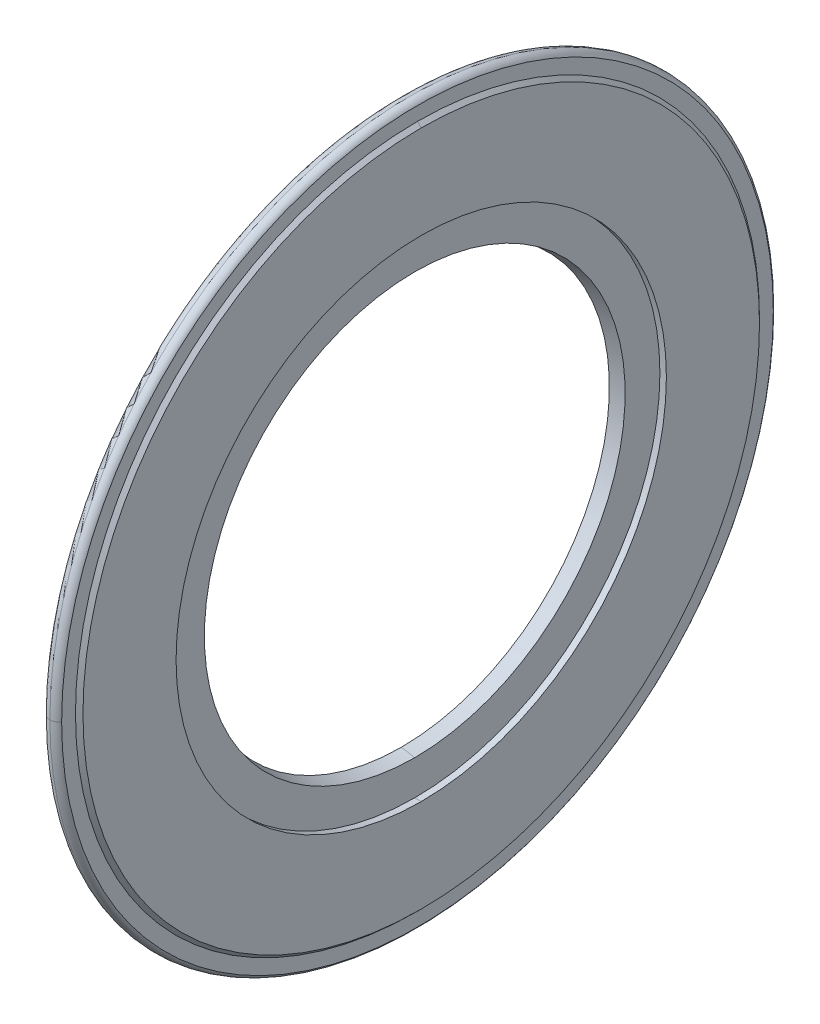
ISO-10303-21;
HEADER;
FILE_DESCRIPTION(('STEP AP214'),'2;1');
FILE_NAME('part.step','',(''),(''),'','','');
FILE_SCHEMA(('AUTOMOTIVE_DESIGN { 1 0 10303 214 1 1 1 1 }'));
ENDSEC;
DATA;
#1=APPLICATION_CONTEXT('core data for automotive mechanical design processes');
#2=APPLICATION_PROTOCOL_DEFINITION('international standard','automotive_design',2000,#1);
#3=PRODUCT_CONTEXT('',#1,'mechanical');
#4=PRODUCT('Part','Part','',(#3));
#5=PRODUCT_RELATED_PRODUCT_CATEGORY('part','',(#4));
#6=PRODUCT_DEFINITION_FORMATION('','',#4);
#7=PRODUCT_DEFINITION_CONTEXT('part definition',#1,'design');
#8=PRODUCT_DEFINITION('design','',#6,#7);
#9=PRODUCT_DEFINITION_SHAPE('','',#8);
#10=(LENGTH_UNIT() NAMED_UNIT(*) SI_UNIT(.MILLI.,.METRE.));
#11=(NAMED_UNIT(*) PLANE_ANGLE_UNIT() SI_UNIT($,.RADIAN.));
#12=(NAMED_UNIT(*) SI_UNIT($,.STERADIAN.) SOLID_ANGLE_UNIT());
#13=UNCERTAINTY_MEASURE_WITH_UNIT(LENGTH_MEASURE(1.E-05),#10,'distance_accuracy_value','');
#14=(GEOMETRIC_REPRESENTATION_CONTEXT(3) GLOBAL_UNCERTAINTY_ASSIGNED_CONTEXT((#13)) GLOBAL_UNIT_ASSIGNED_CONTEXT((#10,
#11,#12)) REPRESENTATION_CONTEXT('',''));
#15=CARTESIAN_POINT('',(0.,0.,0.));
#16=DIRECTION('',(0.,0.,1.));
#17=DIRECTION('',(1.,0.,0.));
#18=AXIS2_PLACEMENT_3D('',#15,#16,#17);
#19=CARTESIAN_POINT('',(7.4756,0.,0.));
#20=DIRECTION('',(1.,0.,0.));
#21=DIRECTION('',(0.,1.,0.));
#22=AXIS2_PLACEMENT_3D('',#19,#20,#21);
#23=CONICAL_SURFACE('',#22,7.36375359064417,0.174532925199433);
#24=DIRECTION('',(-0.984807753012208,-0.17364817766693,0.));
#25=VECTOR('',#24,1.);
#26=CARTESIAN_POINT('',(7.4756,7.36375359064417,0.));
#27=LINE('',#26,#25);
#28=CARTESIAN_POINT('',(7.7112,7.40529622729908,0.));
#29=VERTEX_POINT('',#28);
#30=CARTESIAN_POINT('',(7.24,7.32221095398925,0.));
#31=VERTEX_POINT('',#30);
#32=EDGE_CURVE('E138',#29,#31,#27,.T.);
#33=ORIENTED_EDGE('',*,*,#32,.T.);
#34=CARTESIAN_POINT('',(7.24,0.,0.));
#35=DIRECTION('',(-1.,0.,0.));
#36=DIRECTION('',(0.,1.,0.));
#37=AXIS2_PLACEMENT_3D('',#34,#35,#36);
#38=CIRCLE('',#37,7.32221095398925);
#39=CARTESIAN_POINT('',(7.24,-7.32221095398925,0.));
#40=VERTEX_POINT('',#39);
#41=EDGE_CURVE('E11',#31,#40,#38,.T.);
#42=ORIENTED_EDGE('',*,*,#41,.T.);
#43=DIRECTION('',(0.984807753012208,-0.17364817766693,0.));
#44=VECTOR('',#43,1.);
#45=CARTESIAN_POINT('',(7.4756,-7.36375359064417,0.));
#46=LINE('',#45,#44);
#47=CARTESIAN_POINT('',(7.7112,-7.40529622729908,0.));
#48=VERTEX_POINT('',#47);
#49=EDGE_CURVE('E132',#40,#48,#46,.T.);
#50=ORIENTED_EDGE('',*,*,#49,.T.);
#51=CARTESIAN_POINT('',(7.7112,0.,0.));
#52=DIRECTION('',(-1.,0.,0.));
#53=DIRECTION('',(0.,1.,0.));
#54=AXIS2_PLACEMENT_3D('',#51,#52,#53);
#55=CIRCLE('',#54,7.40529622729908);
#56=EDGE_CURVE('E120',#29,#48,#55,.T.);
#57=ORIENTED_EDGE('',*,*,#56,.F.);
#58=EDGE_LOOP('',(#33,#42,#50,#57));
#59=FACE_BOUND('',#58,.T.);
#60=ADVANCED_FACE('F17',(#59),#23,.F.);
#61=CARTESIAN_POINT('',(7.1248109574196,0.,0.));
#62=DIRECTION('',(-1.,0.,0.));
#63=DIRECTION('',(0.,1.,0.));
#64=AXIS2_PLACEMENT_3D('',#61,#62,#63);
#65=CONICAL_SURFACE('',#64,7.97548047699463,1.39626340159546);
#66=DIRECTION('',(-0.17364817766693,0.984807753012208,0.));
#67=VECTOR('',#66,1.);
#68=CARTESIAN_POINT('',(7.1248109574196,7.97548047699463,0.));
#69=LINE('',#68,#67);
#70=CARTESIAN_POINT('',(7.00962191483921,8.62875,0.));
#71=VERTEX_POINT('',#70);
#72=EDGE_CURVE('E151',#31,#71,#69,.T.);
#73=ORIENTED_EDGE('',*,*,#72,.T.);
#74=CARTESIAN_POINT('',(7.00962191483921,0.,0.));
#75=DIRECTION('',(-1.,0.,0.));
#76=DIRECTION('',(0.,1.,0.));
#77=AXIS2_PLACEMENT_3D('',#74,#75,#76);
#78=CIRCLE('',#77,8.62875);
#79=CARTESIAN_POINT('',(7.00962191483921,-8.62875,0.));
#80=VERTEX_POINT('',#79);
#81=EDGE_CURVE('E25',#71,#80,#78,.T.);
#82=ORIENTED_EDGE('',*,*,#81,.T.);
#83=DIRECTION('',(0.17364817766693,0.984807753012208,0.));
#84=VECTOR('',#83,1.);
#85=CARTESIAN_POINT('',(7.1248109574196,-7.97548047699463,0.));
#86=LINE('',#85,#84);
#87=EDGE_CURVE('E154',#80,#40,#86,.T.);
#88=ORIENTED_EDGE('',*,*,#87,.T.);
#89=ORIENTED_EDGE('',*,*,#41,.F.);
#90=EDGE_LOOP('',(#73,#82,#88,#89));
#91=FACE_BOUND('',#90,.T.);
#92=ADVANCED_FACE('F225',(#91),#65,.F.);
#93=CARTESIAN_POINT('',(6.8968109574196,0.,0.));
#94=DIRECTION('',(-1.,0.,0.));
#95=DIRECTION('',(0.,1.,0.));
#96=AXIS2_PLACEMENT_3D('',#93,#94,#95);
#97=CYLINDRICAL_SURFACE('',#96,8.62875);
#98=DIRECTION('',(-1.,0.,0.));
#99=VECTOR('',#98,1.);
#100=CARTESIAN_POINT('',(6.8968109574196,8.62875,0.));
#101=LINE('',#100,#99);
#102=CARTESIAN_POINT('',(6.784,8.62875,0.));
#103=VERTEX_POINT('',#102);
#104=EDGE_CURVE('E158',#71,#103,#101,.T.);
#105=ORIENTED_EDGE('',*,*,#104,.T.);
#106=CARTESIAN_POINT('',(6.784,0.,0.));
#107=DIRECTION('',(-1.,0.,0.));
#108=DIRECTION('',(0.,1.,0.));
#109=AXIS2_PLACEMENT_3D('',#106,#107,#108);
#110=CIRCLE('',#109,8.62875);
#111=CARTESIAN_POINT('',(6.784,-8.62875,0.));
#112=VERTEX_POINT('',#111);
#113=EDGE_CURVE('E172',#103,#112,#110,.T.);
#114=ORIENTED_EDGE('',*,*,#113,.T.);
#115=DIRECTION('',(1.,0.,0.));
#116=VECTOR('',#115,1.);
#117=CARTESIAN_POINT('',(6.8968109574196,-8.62875,0.));
#118=LINE('',#117,#116);
#119=EDGE_CURVE('E163',#112,#80,#118,.T.);
#120=ORIENTED_EDGE('',*,*,#119,.T.);
#121=ORIENTED_EDGE('',*,*,#81,.F.);
#122=EDGE_LOOP('',(#105,#114,#120,#121));
#123=FACE_BOUND('',#122,.T.);
#124=ADVANCED_FACE('F234',(#123),#97,.F.);
#125=CARTESIAN_POINT('',(7.1336,0.,0.));
#126=DIRECTION('',(1.,0.,0.));
#127=DIRECTION('',(0.,1.,0.));
#128=AXIS2_PLACEMENT_3D('',#125,#126,#127);
#129=CONICAL_SURFACE('',#128,8.97835,0.785398163397447);
#130=DIRECTION('',(-0.707106781186548,-0.707106781186547,0.));
#131=VECTOR('',#130,1.);
#132=CARTESIAN_POINT('',(7.1336,8.97835,0.));
#133=LINE('',#132,#131);
#134=CARTESIAN_POINT('',(7.4832,9.32795,0.));
#135=VERTEX_POINT('',#134);
#136=EDGE_CURVE('E162',#135,#103,#133,.T.);
#137=ORIENTED_EDGE('',*,*,#136,.T.);
#138=CARTESIAN_POINT('',(6.784,0.,0.));
#139=DIRECTION('',(-1.,0.,0.));
#140=DIRECTION('',(0.,1.,0.));
#141=AXIS2_PLACEMENT_3D('',#138,#139,#140);
#142=CIRCLE('',#141,8.62875);
#143=EDGE_CURVE('E159',#112,#103,#142,.T.);
#144=ORIENTED_EDGE('',*,*,#143,.F.);
#145=DIRECTION('',(0.707106781186548,-0.707106781186547,0.));
#146=VECTOR('',#145,1.);
#147=CARTESIAN_POINT('',(7.1336,-8.97835,0.));
#148=LINE('',#147,#146);
#149=CARTESIAN_POINT('',(7.4832,-9.32795,0.));
#150=VERTEX_POINT('',#149);
#151=EDGE_CURVE('E169',#112,#150,#148,.T.);
#152=ORIENTED_EDGE('',*,*,#151,.T.);
#153=CARTESIAN_POINT('',(7.4832,0.,0.));
#154=DIRECTION('',(-1.,0.,0.));
#155=DIRECTION('',(0.,1.,0.));
#156=AXIS2_PLACEMENT_3D('',#153,#154,#155);
#157=CIRCLE('',#156,9.32795);
#158=EDGE_CURVE('E222',#150,#135,#157,.T.);
#159=ORIENTED_EDGE('',*,*,#158,.T.);
#160=EDGE_LOOP('',(#137,#144,#152,#159));
#161=FACE_BOUND('',#160,.T.);
#162=ADVANCED_FACE('F294',(#161),#129,.T.);
#163=CARTESIAN_POINT('',(7.4832,10.4936875,0.));
#164=DIRECTION('',(-1.,0.,0.));
#165=DIRECTION('',(0.,0.,1.));
#166=AXIS2_PLACEMENT_3D('',#163,#164,#165);
#167=PLANE('',#166);
#168=CARTESIAN_POINT('',(7.4832,0.,0.));
#169=DIRECTION('',(-1.,0.,0.));
#170=DIRECTION('',(0.,1.,0.));
#171=AXIS2_PLACEMENT_3D('',#168,#169,#170);
#172=CIRCLE('',#171,9.32795);
#173=EDGE_CURVE('E166',#135,#150,#172,.T.);
#174=ORIENTED_EDGE('',*,*,#173,.F.);
#175=ORIENTED_EDGE('',*,*,#158,.F.);
#176=EDGE_LOOP('',(#174,#175));
#177=FACE_BOUND('',#176,.T.);
#178=CARTESIAN_POINT('',(7.4832,0.,0.));
#179=DIRECTION('',(-1.,0.,0.));
#180=DIRECTION('',(0.,1.,0.));
#181=AXIS2_PLACEMENT_3D('',#178,#179,#180);
#182=CIRCLE('',#181,11.659425);
#183=CARTESIAN_POINT('',(7.4832,11.659425,0.));
#184=VERTEX_POINT('',#183);
#185=CARTESIAN_POINT('',(7.4832,-11.659425,0.));
#186=VERTEX_POINT('',#185);
#187=EDGE_CURVE('E220',#184,#186,#182,.T.);
#188=ORIENTED_EDGE('',*,*,#187,.T.);
#189=CARTESIAN_POINT('',(7.4832,0.,0.));
#190=DIRECTION('',(-1.,0.,0.));
#191=DIRECTION('',(0.,1.,0.));
#192=AXIS2_PLACEMENT_3D('',#189,#190,#191);
#193=CIRCLE('',#192,11.659425);
#194=EDGE_CURVE('E177',#186,#184,#193,.T.);
#195=ORIENTED_EDGE('',*,*,#194,.T.);
#196=EDGE_LOOP('',(#188,#195));
#197=FACE_BOUND('',#196,.T.);
#198=ADVANCED_FACE('F299',(#177,#197),#167,.T.);
#199=CARTESIAN_POINT('',(7.29640031699767,0.,0.));
#200=DIRECTION('',(-1.,0.,0.));
#201=DIRECTION('',(0.,1.,0.));
#202=AXIS2_PLACEMENT_3D('',#199,#200,#201);
#203=CYLINDRICAL_SURFACE('',#202,11.659425);
#204=DIRECTION('',(-1.,0.,0.));
#205=VECTOR('',#204,1.);
#206=CARTESIAN_POINT('',(7.29640031699767,11.659425,0.));
#207=LINE('',#206,#205);
#208=CARTESIAN_POINT('',(7.10960063399534,11.659425,0.));
#209=VERTEX_POINT('',#208);
#210=EDGE_CURVE('E174',#184,#209,#207,.T.);
#211=ORIENTED_EDGE('',*,*,#210,.T.);
#212=CARTESIAN_POINT('',(7.10960063399534,0.,0.));
#213=DIRECTION('',(-1.,0.,0.));
#214=DIRECTION('',(0.,1.,0.));
#215=AXIS2_PLACEMENT_3D('',#212,#213,#214);
#216=CIRCLE('',#215,11.659425);
#217=CARTESIAN_POINT('',(7.10960063399534,-11.659425,0.));
#218=VERTEX_POINT('',#217);
#219=EDGE_CURVE('E198',#209,#218,#216,.T.);
#220=ORIENTED_EDGE('',*,*,#219,.T.);
#221=DIRECTION('',(1.,0.,0.));
#222=VECTOR('',#221,1.);
#223=CARTESIAN_POINT('',(7.29640031699767,-11.659425,0.));
#224=LINE('',#223,#222);
#225=EDGE_CURVE('E180',#218,#186,#224,.T.);
#226=ORIENTED_EDGE('',*,*,#225,.T.);
#227=ORIENTED_EDGE('',*,*,#187,.F.);
#228=EDGE_LOOP('',(#211,#220,#226,#227));
#229=FACE_BOUND('',#228,.T.);
#230=ADVANCED_FACE('F303',(#229),#203,.F.);
#231=CARTESIAN_POINT('',(7.17710953853982,0.,0.));
#232=DIRECTION('',(1.,0.,0.));
#233=DIRECTION('',(0.,1.,0.));
#234=AXIS2_PLACEMENT_3D('',#231,#232,#233);
#235=CONICAL_SURFACE('',#234,12.0422870230054,1.39626340159546);
#236=DIRECTION('',(-0.173648177666931,-0.984807753012208,0.));
#237=VECTOR('',#236,1.);
#238=CARTESIAN_POINT('',(7.17710953853982,12.0422870230054,0.));
#239=LINE('',#238,#237);
#240=CARTESIAN_POINT('',(7.24461844308429,12.4251490460107,0.));
#241=VERTEX_POINT('',#240);
#242=EDGE_CURVE('E186',#241,#209,#239,.T.);
#243=ORIENTED_EDGE('',*,*,#242,.T.);
#244=CARTESIAN_POINT('',(7.10960063399534,0.,0.));
#245=DIRECTION('',(-1.,0.,0.));
#246=DIRECTION('',(0.,1.,0.));
#247=AXIS2_PLACEMENT_3D('',#244,#245,#246);
#248=CIRCLE('',#247,11.659425);
#249=EDGE_CURVE('E183',#218,#209,#248,.T.);
#250=ORIENTED_EDGE('',*,*,#249,.F.);
#251=DIRECTION('',(0.173648177666931,-0.984807753012208,0.));
#252=VECTOR('',#251,1.);
#253=CARTESIAN_POINT('',(7.17710953853982,-12.0422870230054,0.));
#254=LINE('',#253,#252);
#255=CARTESIAN_POINT('',(7.24461844308429,-12.4251490460107,0.));
#256=VERTEX_POINT('',#255);
#257=EDGE_CURVE('E195',#218,#256,#254,.T.);
#258=ORIENTED_EDGE('',*,*,#257,.T.);
#259=CARTESIAN_POINT('',(7.24461844308429,0.,0.));
#260=DIRECTION('',(-1.,0.,0.));
#261=DIRECTION('',(0.,1.,0.));
#262=AXIS2_PLACEMENT_3D('',#259,#260,#261);
#263=CIRCLE('',#262,12.4251490460107);
#264=CARTESIAN_POINT('',(7.24461844308429,0.,12.4251490460107));
#265=VERTEX_POINT('',#264);
#266=EDGE_CURVE('E218',#256,#265,#263,.T.);
#267=ORIENTED_EDGE('',*,*,#266,.T.);
#268=CARTESIAN_POINT('',(7.24461844308429,0.,0.));
#269=DIRECTION('',(-1.,0.,0.));
#270=DIRECTION('',(0.,1.,0.));
#271=AXIS2_PLACEMENT_3D('',#268,#269,#270);
#272=CIRCLE('',#271,12.4251490460107);
#273=EDGE_CURVE('E203',#265,#241,#272,.T.);
#274=ORIENTED_EDGE('',*,*,#273,.T.);
#275=EDGE_LOOP('',(#243,#250,#258,#267,#274));
#276=FACE_BOUND('',#275,.T.);
#277=ADVANCED_FACE('F307',(#276),#235,.T.);
#278=CARTESIAN_POINT('',(7.544,0.,0.));
#279=DIRECTION('',(-1.,0.,0.));
#280=DIRECTION('',(0.,0.,1.));
#281=AXIS2_PLACEMENT_3D('',#278,#279,#280);
#282=TOROIDAL_SURFACE('',#281,12.37236,0.304);
#283=CARTESIAN_POINT('',(7.544,0.,0.));
#284=DIRECTION('',(-1.,0.,0.));
#285=DIRECTION('',(0.,0.,1.));
#286=AXIS2_PLACEMENT_3D('',#283,#284,#285);
#287=CIRCLE('',#286,12.67636);
#288=CARTESIAN_POINT('',(7.544,0.,-12.67636));
#289=VERTEX_POINT('',#288);
#290=CARTESIAN_POINT('',(7.544,0.,12.67636));
#291=VERTEX_POINT('',#290);
#292=EDGE_CURVE('E244',#289,#291,#287,.T.);
#293=ORIENTED_EDGE('',*,*,#292,.T.);
#294=CARTESIAN_POINT('',(7.544,0.,12.37236));
#295=DIRECTION('',(0.,-1.,0.));
#296=DIRECTION('',(0.,0.,1.));
#297=AXIS2_PLACEMENT_3D('',#294,#295,#296);
#298=CIRCLE('',#297,0.304);
#299=EDGE_CURVE('E205',#291,#265,#298,.T.);
#300=ORIENTED_EDGE('',*,*,#299,.T.);
#301=ORIENTED_EDGE('',*,*,#266,.F.);
#302=CARTESIAN_POINT('',(7.24461844308429,0.,0.));
#303=DIRECTION('',(-1.,0.,0.));
#304=DIRECTION('',(0.,1.,0.));
#305=AXIS2_PLACEMENT_3D('',#302,#303,#304);
#306=CIRCLE('',#305,12.4251490460107);
#307=CARTESIAN_POINT('',(7.24461844308429,0.,-12.4251490460107));
#308=VERTEX_POINT('',#307);
#309=EDGE_CURVE('E192',#308,#256,#306,.T.);
#310=ORIENTED_EDGE('',*,*,#309,.F.);
#311=CARTESIAN_POINT('',(7.544,0.,-12.37236));
#312=DIRECTION('',(0.,-1.,0.));
#313=DIRECTION('',(0.,0.,-1.));
#314=AXIS2_PLACEMENT_3D('',#311,#312,#313);
#315=CIRCLE('',#314,0.304);
#316=EDGE_CURVE('E200',#308,#289,#315,.T.);
#317=ORIENTED_EDGE('',*,*,#316,.T.);
#318=EDGE_LOOP('',(#293,#300,#301,#310,#317));
#319=FACE_BOUND('',#318,.T.);
#320=ADVANCED_FACE('F311',(#319),#282,.T.);
#321=CARTESIAN_POINT('',(7.80727172275047,12.28116,0.));
#322=DIRECTION('',(1.,0.,0.));
#323=DIRECTION('',(0.,0.,1.));
#324=AXIS2_PLACEMENT_3D('',#321,#322,#323);
#325=PLANE('',#324);
#326=CARTESIAN_POINT('',(7.80727172275047,0.,0.));
#327=DIRECTION('',(-1.,0.,0.));
#328=DIRECTION('',(0.,1.,0.));
#329=AXIS2_PLACEMENT_3D('',#326,#327,#328);
#330=CIRCLE('',#329,12.03796);
#331=CARTESIAN_POINT('',(7.80727172275047,12.03796,0.));
#332=VERTEX_POINT('',#331);
#333=CARTESIAN_POINT('',(7.80727172275047,-12.03796,0.));
#334=VERTEX_POINT('',#333);
#335=EDGE_CURVE('E214',#332,#334,#330,.T.);
#336=ORIENTED_EDGE('',*,*,#335,.T.);
#337=CARTESIAN_POINT('',(7.80727172275047,0.,0.));
#338=DIRECTION('',(-1.,0.,0.));
#339=DIRECTION('',(0.,1.,0.));
#340=AXIS2_PLACEMENT_3D('',#337,#338,#339);
#341=CIRCLE('',#340,12.03796);
#342=EDGE_CURVE('E94',#334,#332,#341,.T.);
#343=ORIENTED_EDGE('',*,*,#342,.T.);
#344=EDGE_LOOP('',(#336,#343));
#345=FACE_BOUND('',#344,.T.);
#346=CARTESIAN_POINT('',(7.80727172275047,0.,0.));
#347=DIRECTION('',(-1.,0.,0.));
#348=DIRECTION('',(0.,1.,0.));
#349=AXIS2_PLACEMENT_3D('',#346,#347,#348);
#350=CIRCLE('',#349,12.52436);
#351=CARTESIAN_POINT('',(7.80727172275047,0.,12.52436));
#352=VERTEX_POINT('',#351);
#353=CARTESIAN_POINT('',(7.80727172275047,0.,-12.52436));
#354=VERTEX_POINT('',#353);
#355=EDGE_CURVE('E140',#352,#354,#350,.T.);
#356=ORIENTED_EDGE('',*,*,#355,.F.);
#357=CARTESIAN_POINT('',(7.80727172275047,0.,0.));
#358=DIRECTION('',(-1.,0.,0.));
#359=DIRECTION('',(0.,1.,0.));
#360=AXIS2_PLACEMENT_3D('',#357,#358,#359);
#361=CIRCLE('',#360,12.52436);
#362=EDGE_CURVE('E255',#354,#352,#361,.T.);
#363=ORIENTED_EDGE('',*,*,#362,.F.);
#364=EDGE_LOOP('',(#356,#363));
#365=FACE_BOUND('',#364,.T.);
#366=ADVANCED_FACE('F314',(#345,#365),#325,.T.);
#367=CARTESIAN_POINT('',(7.87323586137523,0.,0.));
#368=DIRECTION('',(-1.,0.,0.));
#369=DIRECTION('',(0.,1.,0.));
#370=AXIS2_PLACEMENT_3D('',#367,#368,#369);
#371=CONICAL_SURFACE('',#370,11.9719958613752,0.785398163397442);
#372=DIRECTION('',(-0.707106781186552,0.707106781186543,0.));
#373=VECTOR('',#372,1.);
#374=CARTESIAN_POINT('',(7.87323586137523,11.9719958613752,0.));
#375=LINE('',#374,#373);
#376=CARTESIAN_POINT('',(7.9392,11.9060317227505,0.));
#377=VERTEX_POINT('',#376);
#378=EDGE_CURVE('E208',#377,#332,#375,.T.);
#379=ORIENTED_EDGE('',*,*,#378,.T.);
#380=ORIENTED_EDGE('',*,*,#342,.F.);
#381=DIRECTION('',(0.707106781186552,0.707106781186543,0.));
#382=VECTOR('',#381,1.);
#383=CARTESIAN_POINT('',(7.87323586137523,-11.9719958613752,0.));
#384=LINE('',#383,#382);
#385=CARTESIAN_POINT('',(7.9392,-11.9060317227505,0.));
#386=VERTEX_POINT('',#385);
#387=EDGE_CURVE('E212',#334,#386,#384,.T.);
#388=ORIENTED_EDGE('',*,*,#387,.T.);
#389=CARTESIAN_POINT('',(7.9392,0.,0.));
#390=DIRECTION('',(-1.,0.,0.));
#391=DIRECTION('',(0.,1.,0.));
#392=AXIS2_PLACEMENT_3D('',#389,#390,#391);
#393=CIRCLE('',#392,11.9060317227505);
#394=EDGE_CURVE('E86',#386,#377,#393,.T.);
#395=ORIENTED_EDGE('',*,*,#394,.T.);
#396=EDGE_LOOP('',(#379,#380,#388,#395));
#397=FACE_BOUND('',#396,.T.);
#398=ADVANCED_FACE('F319',(#397),#371,.T.);
#399=CARTESIAN_POINT('',(7.9392,10.2673908613752,0.));
#400=DIRECTION('',(1.,0.,0.));
#401=DIRECTION('',(0.,1.,0.));
#402=AXIS2_PLACEMENT_3D('',#399,#400,#401);
#403=PLANE('',#402);
#404=CARTESIAN_POINT('',(7.9392,0.,0.));
#405=DIRECTION('',(-1.,0.,0.));
#406=DIRECTION('',(0.,1.,0.));
#407=AXIS2_PLACEMENT_3D('',#404,#405,#406);
#408=CIRCLE('',#407,8.62875);
#409=CARTESIAN_POINT('',(7.9392,8.62875,0.));
#410=VERTEX_POINT('',#409);
#411=CARTESIAN_POINT('',(7.9392,-8.62875,0.));
#412=VERTEX_POINT('',#411);
#413=EDGE_CURVE('E129',#410,#412,#408,.T.);
#414=ORIENTED_EDGE('',*,*,#413,.T.);
#415=CARTESIAN_POINT('',(7.9392,0.,0.));
#416=DIRECTION('',(-1.,0.,0.));
#417=DIRECTION('',(0.,1.,0.));
#418=AXIS2_PLACEMENT_3D('',#415,#416,#417);
#419=CIRCLE('',#418,8.62875);
#420=EDGE_CURVE('E144',#412,#410,#419,.T.);
#421=ORIENTED_EDGE('',*,*,#420,.T.);
#422=EDGE_LOOP('',(#414,#421));
#423=FACE_BOUND('',#422,.T.);
#424=CARTESIAN_POINT('',(7.9392,0.,0.));
#425=DIRECTION('',(-1.,0.,0.));
#426=DIRECTION('',(0.,1.,0.));
#427=AXIS2_PLACEMENT_3D('',#424,#425,#426);
#428=CIRCLE('',#427,11.9060317227505);
#429=EDGE_CURVE('E211',#377,#386,#428,.T.);
#430=ORIENTED_EDGE('',*,*,#429,.F.);
#431=ORIENTED_EDGE('',*,*,#394,.F.);
#432=EDGE_LOOP('',(#430,#431));
#433=FACE_BOUND('',#432,.T.);
#434=ADVANCED_FACE('F270',(#423,#433),#403,.T.);
#435=CARTESIAN_POINT('',(7.8252,0.,0.));
#436=DIRECTION('',(-1.,0.,0.));
#437=DIRECTION('',(0.,1.,0.));
#438=AXIS2_PLACEMENT_3D('',#435,#436,#437);
#439=CYLINDRICAL_SURFACE('',#438,8.62875);
#440=DIRECTION('',(-1.,0.,0.));
#441=VECTOR('',#440,1.);
#442=CARTESIAN_POINT('',(7.8252,8.62875,0.));
#443=LINE('',#442,#441);
#444=CARTESIAN_POINT('',(7.7112,8.62875,0.));
#445=VERTEX_POINT('',#444);
#446=EDGE_CURVE('E249',#410,#445,#443,.T.);
#447=ORIENTED_EDGE('',*,*,#446,.T.);
#448=CARTESIAN_POINT('',(7.7112,0.,0.));
#449=DIRECTION('',(-1.,0.,0.));
#450=DIRECTION('',(0.,1.,0.));
#451=AXIS2_PLACEMENT_3D('',#448,#449,#450);
#452=CIRCLE('',#451,8.62875);
#453=CARTESIAN_POINT('',(7.7112,-8.62875,0.));
#454=VERTEX_POINT('',#453);
#455=EDGE_CURVE('E33',#445,#454,#452,.T.);
#456=ORIENTED_EDGE('',*,*,#455,.T.);
#457=DIRECTION('',(1.,0.,0.));
#458=VECTOR('',#457,1.);
#459=CARTESIAN_POINT('',(7.8252,-8.62875,0.));
#460=LINE('',#459,#458);
#461=EDGE_CURVE('E145',#454,#412,#460,.T.);
#462=ORIENTED_EDGE('',*,*,#461,.T.);
#463=ORIENTED_EDGE('',*,*,#413,.F.);
#464=EDGE_LOOP('',(#447,#456,#462,#463));
#465=FACE_BOUND('',#464,.T.);
#466=ADVANCED_FACE('F275',(#465),#439,.F.);
#467=CARTESIAN_POINT('',(7.7112,8.01702311364954,0.));
#468=DIRECTION('',(1.,0.,0.));
#469=DIRECTION('',(0.,-1.,0.));
#470=AXIS2_PLACEMENT_3D('',#467,#468,#469);
#471=PLANE('',#470);
#472=ORIENTED_EDGE('',*,*,#56,.T.);
#473=CARTESIAN_POINT('',(7.7112,0.,0.));
#474=DIRECTION('',(-1.,0.,0.));
#475=DIRECTION('',(0.,1.,0.));
#476=AXIS2_PLACEMENT_3D('',#473,#474,#475);
#477=CIRCLE('',#476,7.40529622729908);
#478=EDGE_CURVE('E125',#48,#29,#477,.T.);
#479=ORIENTED_EDGE('',*,*,#478,.T.);
#480=EDGE_LOOP('',(#472,#479));
#481=FACE_BOUND('',#480,.T.);
#482=ORIENTED_EDGE('',*,*,#455,.F.);
#483=CARTESIAN_POINT('',(7.7112,0.,0.));
#484=DIRECTION('',(-1.,0.,0.));
#485=DIRECTION('',(0.,1.,0.));
#486=AXIS2_PLACEMENT_3D('',#483,#484,#485);
#487=CIRCLE('',#486,8.62875);
#488=EDGE_CURVE('E146',#454,#445,#487,.T.);
#489=ORIENTED_EDGE('',*,*,#488,.F.);
#490=EDGE_LOOP('',(#482,#489));
#491=FACE_BOUND('',#490,.T.);
#492=ADVANCED_FACE('F122',(#481,#491),#471,.T.);
#493=CARTESIAN_POINT('',(7.8252,0.,0.));
#494=DIRECTION('',(-1.,0.,0.));
#495=DIRECTION('',(0.,1.,0.));
#496=AXIS2_PLACEMENT_3D('',#493,#494,#495);
#497=CYLINDRICAL_SURFACE('',#496,8.62875);
#498=ORIENTED_EDGE('',*,*,#446,.F.);
#499=ORIENTED_EDGE('',*,*,#420,.F.);
#500=ORIENTED_EDGE('',*,*,#461,.F.);
#501=ORIENTED_EDGE('',*,*,#488,.T.);
#502=EDGE_LOOP('',(#498,#499,#500,#501));
#503=FACE_BOUND('',#502,.T.);
#504=ADVANCED_FACE('F273',(#503),#497,.F.);
#505=CARTESIAN_POINT('',(7.87323586137523,0.,0.));
#506=DIRECTION('',(-1.,0.,0.));
#507=DIRECTION('',(0.,1.,0.));
#508=AXIS2_PLACEMENT_3D('',#505,#506,#507);
#509=CONICAL_SURFACE('',#508,11.9719958613752,0.785398163397442);
#510=ORIENTED_EDGE('',*,*,#378,.F.);
#511=ORIENTED_EDGE('',*,*,#429,.T.);
#512=ORIENTED_EDGE('',*,*,#387,.F.);
#513=ORIENTED_EDGE('',*,*,#335,.F.);
#514=EDGE_LOOP('',(#510,#511,#512,#513));
#515=FACE_BOUND('',#514,.T.);
#516=ADVANCED_FACE('F282',(#515),#509,.T.);
#517=CARTESIAN_POINT('',(7.544,0.,0.));
#518=DIRECTION('',(-1.,0.,0.));
#519=DIRECTION('',(0.,0.,1.));
#520=AXIS2_PLACEMENT_3D('',#517,#518,#519);
#521=TOROIDAL_SURFACE('',#520,12.37236,0.304);
#522=CARTESIAN_POINT('',(7.544,0.,0.));
#523=DIRECTION('',(-1.,0.,0.));
#524=DIRECTION('',(0.,0.,1.));
#525=AXIS2_PLACEMENT_3D('',#522,#523,#524);
#526=CIRCLE('',#525,12.67636);
#527=EDGE_CURVE('E252',#291,#289,#526,.T.);
#528=ORIENTED_EDGE('',*,*,#527,.T.);
#529=ORIENTED_EDGE('',*,*,#316,.F.);
#530=CARTESIAN_POINT('',(7.24461844308429,0.,0.));
#531=DIRECTION('',(-1.,0.,0.));
#532=DIRECTION('',(0.,1.,0.));
#533=AXIS2_PLACEMENT_3D('',#530,#531,#532);
#534=CIRCLE('',#533,12.4251490460107);
#535=EDGE_CURVE('E189',#241,#308,#534,.T.);
#536=ORIENTED_EDGE('',*,*,#535,.F.);
#537=ORIENTED_EDGE('',*,*,#273,.F.);
#538=ORIENTED_EDGE('',*,*,#299,.F.);
#539=EDGE_LOOP('',(#528,#529,#536,#537,#538));
#540=FACE_BOUND('',#539,.T.);
#541=ADVANCED_FACE('F324',(#540),#521,.T.);
#542=CARTESIAN_POINT('',(7.17710953853982,0.,0.));
#543=DIRECTION('',(1.,0.,0.));
#544=DIRECTION('',(0.,1.,0.));
#545=AXIS2_PLACEMENT_3D('',#542,#543,#544);
#546=CONICAL_SURFACE('',#545,12.0422870230054,1.39626340159546);
#547=ORIENTED_EDGE('',*,*,#242,.F.);
#548=ORIENTED_EDGE('',*,*,#535,.T.);
#549=ORIENTED_EDGE('',*,*,#309,.T.);
#550=ORIENTED_EDGE('',*,*,#257,.F.);
#551=ORIENTED_EDGE('',*,*,#219,.F.);
#552=EDGE_LOOP('',(#547,#548,#549,#550,#551));
#553=FACE_BOUND('',#552,.T.);
#554=ADVANCED_FACE('F320',(#553),#546,.T.);
#555=CARTESIAN_POINT('',(7.29640031699767,0.,0.));
#556=DIRECTION('',(-1.,0.,0.));
#557=DIRECTION('',(0.,1.,0.));
#558=AXIS2_PLACEMENT_3D('',#555,#556,#557);
#559=CYLINDRICAL_SURFACE('',#558,11.659425);
#560=ORIENTED_EDGE('',*,*,#210,.F.);
#561=ORIENTED_EDGE('',*,*,#194,.F.);
#562=ORIENTED_EDGE('',*,*,#225,.F.);
#563=ORIENTED_EDGE('',*,*,#249,.T.);
#564=EDGE_LOOP('',(#560,#561,#562,#563));
#565=FACE_BOUND('',#564,.T.);
#566=ADVANCED_FACE('F323',(#565),#559,.F.);
#567=CARTESIAN_POINT('',(7.1336,0.,0.));
#568=DIRECTION('',(1.,0.,0.));
#569=DIRECTION('',(0.,1.,0.));
#570=AXIS2_PLACEMENT_3D('',#567,#568,#569);
#571=CONICAL_SURFACE('',#570,8.97835,0.785398163397447);
#572=ORIENTED_EDGE('',*,*,#136,.F.);
#573=ORIENTED_EDGE('',*,*,#173,.T.);
#574=ORIENTED_EDGE('',*,*,#151,.F.);
#575=ORIENTED_EDGE('',*,*,#113,.F.);
#576=EDGE_LOOP('',(#572,#573,#574,#575));
#577=FACE_BOUND('',#576,.T.);
#578=ADVANCED_FACE('F329',(#577),#571,.T.);
#579=CARTESIAN_POINT('',(6.8968109574196,0.,0.));
#580=DIRECTION('',(-1.,0.,0.));
#581=DIRECTION('',(0.,1.,0.));
#582=AXIS2_PLACEMENT_3D('',#579,#580,#581);
#583=CYLINDRICAL_SURFACE('',#582,8.62875);
#584=ORIENTED_EDGE('',*,*,#104,.F.);
#585=CARTESIAN_POINT('',(7.00962191483921,0.,0.));
#586=DIRECTION('',(-1.,0.,0.));
#587=DIRECTION('',(0.,1.,0.));
#588=AXIS2_PLACEMENT_3D('',#585,#586,#587);
#589=CIRCLE('',#588,8.62875);
#590=EDGE_CURVE('E155',#80,#71,#589,.T.);
#591=ORIENTED_EDGE('',*,*,#590,.F.);
#592=ORIENTED_EDGE('',*,*,#119,.F.);
#593=ORIENTED_EDGE('',*,*,#143,.T.);
#594=EDGE_LOOP('',(#584,#591,#592,#593));
#595=FACE_BOUND('',#594,.T.);
#596=ADVANCED_FACE('F239',(#595),#583,.F.);
#597=CARTESIAN_POINT('',(7.1248109574196,0.,0.));
#598=DIRECTION('',(-1.,0.,0.));
#599=DIRECTION('',(0.,1.,0.));
#600=AXIS2_PLACEMENT_3D('',#597,#598,#599);
#601=CONICAL_SURFACE('',#600,7.97548047699463,1.39626340159546);
#602=ORIENTED_EDGE('',*,*,#72,.F.);
#603=CARTESIAN_POINT('',(7.24,0.,0.));
#604=DIRECTION('',(-1.,0.,0.));
#605=DIRECTION('',(0.,1.,0.));
#606=AXIS2_PLACEMENT_3D('',#603,#604,#605);
#607=CIRCLE('',#606,7.32221095398925);
#608=EDGE_CURVE('E135',#40,#31,#607,.T.);
#609=ORIENTED_EDGE('',*,*,#608,.F.);
#610=ORIENTED_EDGE('',*,*,#87,.F.);
#611=ORIENTED_EDGE('',*,*,#590,.T.);
#612=EDGE_LOOP('',(#602,#609,#610,#611));
#613=FACE_BOUND('',#612,.T.);
#614=ADVANCED_FACE('F241',(#613),#601,.F.);
#615=CARTESIAN_POINT('',(7.4756,0.,0.));
#616=DIRECTION('',(1.,0.,0.));
#617=DIRECTION('',(0.,1.,0.));
#618=AXIS2_PLACEMENT_3D('',#615,#616,#617);
#619=CONICAL_SURFACE('',#618,7.36375359064417,0.174532925199433);
#620=ORIENTED_EDGE('',*,*,#32,.F.);
#621=ORIENTED_EDGE('',*,*,#478,.F.);
#622=ORIENTED_EDGE('',*,*,#49,.F.);
#623=ORIENTED_EDGE('',*,*,#608,.T.);
#624=EDGE_LOOP('',(#620,#621,#622,#623));
#625=FACE_BOUND('',#624,.T.);
#626=ADVANCED_FACE('F137',(#625),#619,.F.);
#627=CARTESIAN_POINT('',(7.544,0.,0.));
#628=DIRECTION('',(-1.,0.,0.));
#629=DIRECTION('',(0.,0.,1.));
#630=AXIS2_PLACEMENT_3D('',#627,#628,#629);
#631=TOROIDAL_SURFACE('',#630,12.37236,0.304);
#632=ORIENTED_EDGE('',*,*,#527,.F.);
#633=CARTESIAN_POINT('',(7.544,0.,12.37236));
#634=DIRECTION('',(0.,-1.,0.));
#635=DIRECTION('',(0.,0.,1.));
#636=AXIS2_PLACEMENT_3D('',#633,#634,#635);
#637=CIRCLE('',#636,0.304);
#638=EDGE_CURVE('E258',#352,#291,#637,.T.);
#639=ORIENTED_EDGE('',*,*,#638,.F.);
#640=ORIENTED_EDGE('',*,*,#355,.T.);
#641=CARTESIAN_POINT('',(7.544,0.,-12.37236));
#642=DIRECTION('',(0.,-1.,0.));
#643=DIRECTION('',(0.,0.,-1.));
#644=AXIS2_PLACEMENT_3D('',#641,#642,#643);
#645=CIRCLE('',#644,0.304);
#646=EDGE_CURVE('E247',#289,#354,#645,.T.);
#647=ORIENTED_EDGE('',*,*,#646,.F.);
#648=EDGE_LOOP('',(#632,#639,#640,#647));
#649=FACE_BOUND('',#648,.T.);
#650=ADVANCED_FACE('F353',(#649),#631,.T.);
#651=CARTESIAN_POINT('',(7.544,0.,0.));
#652=DIRECTION('',(-1.,0.,0.));
#653=DIRECTION('',(0.,0.,1.));
#654=AXIS2_PLACEMENT_3D('',#651,#652,#653);
#655=TOROIDAL_SURFACE('',#654,12.37236,0.304);
#656=ORIENTED_EDGE('',*,*,#292,.F.);
#657=ORIENTED_EDGE('',*,*,#646,.T.);
#658=ORIENTED_EDGE('',*,*,#362,.T.);
#659=ORIENTED_EDGE('',*,*,#638,.T.);
#660=EDGE_LOOP('',(#656,#657,#658,#659));
#661=FACE_BOUND('',#660,.T.);
#662=ADVANCED_FACE('F356',(#661),#655,.T.);
#663=CLOSED_SHELL('',(#60,#92,#124,#162,#198,#230,#277,#320,#366,#398,#434,#466,#492,#504,#516,
#541,#554,#566,#578,#596,#614,#626,#650,#662));
#664=MANIFOLD_SOLID_BREP('B1',#663);
#665=ADVANCED_BREP_SHAPE_REPRESENTATION('',(#18,#664),#14);
#666=SHAPE_DEFINITION_REPRESENTATION(#9,#665);
ENDSEC;
END-ISO-10303-21;
